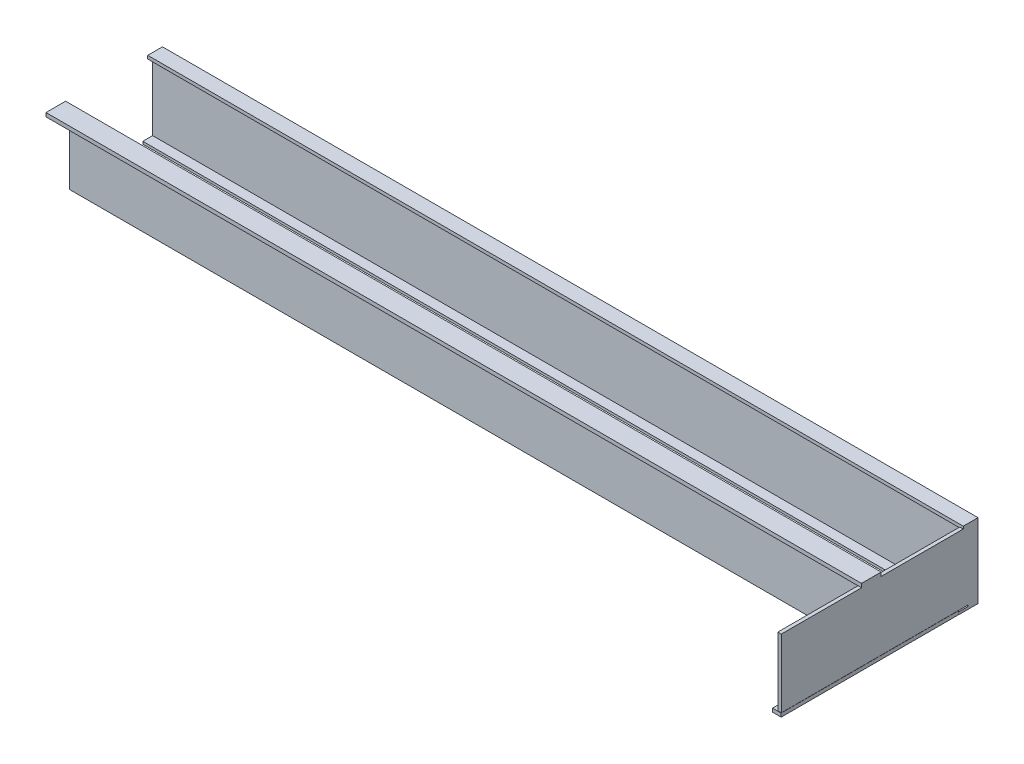
ISO-10303-21;
HEADER;
FILE_DESCRIPTION(('STEP AP214'),'2;1');
FILE_NAME('part.step','',(''),(''),'','','');
FILE_SCHEMA(('AUTOMOTIVE_DESIGN { 1 0 10303 214 1 1 1 1 }'));
ENDSEC;
DATA;
#1=APPLICATION_CONTEXT('core data for automotive mechanical design processes');
#2=APPLICATION_PROTOCOL_DEFINITION('international standard','automotive_design',2000,#1);
#3=PRODUCT_CONTEXT('',#1,'mechanical');
#4=PRODUCT('Part','Part','',(#3));
#5=PRODUCT_RELATED_PRODUCT_CATEGORY('part','',(#4));
#6=PRODUCT_DEFINITION_FORMATION('','',#4);
#7=PRODUCT_DEFINITION_CONTEXT('part definition',#1,'design');
#8=PRODUCT_DEFINITION('design','',#6,#7);
#9=PRODUCT_DEFINITION_SHAPE('','',#8);
#10=(LENGTH_UNIT() NAMED_UNIT(*) SI_UNIT(.MILLI.,.METRE.));
#11=(NAMED_UNIT(*) PLANE_ANGLE_UNIT() SI_UNIT($,.RADIAN.));
#12=(NAMED_UNIT(*) SI_UNIT($,.STERADIAN.) SOLID_ANGLE_UNIT());
#13=UNCERTAINTY_MEASURE_WITH_UNIT(LENGTH_MEASURE(1.E-05),#10,'distance_accuracy_value','');
#14=(GEOMETRIC_REPRESENTATION_CONTEXT(3) GLOBAL_UNCERTAINTY_ASSIGNED_CONTEXT((#13)) GLOBAL_UNIT_ASSIGNED_CONTEXT((#10,
#11,#12)) REPRESENTATION_CONTEXT('',''));
#15=CARTESIAN_POINT('',(0.,0.,0.));
#16=DIRECTION('',(0.,0.,1.));
#17=DIRECTION('',(1.,0.,0.));
#18=AXIS2_PLACEMENT_3D('',#15,#16,#17);
#19=CARTESIAN_POINT('',(752.65421688897,48.3167027315402,200.2));
#20=DIRECTION('',(0.,1.,0.));
#21=DIRECTION('',(0.,0.,1.));
#22=AXIS2_PLACEMENT_3D('',#19,#20,#21);
#23=PLANE('',#22);
#24=DIRECTION('',(0.,0.,-1.));
#25=VECTOR('',#24,1.);
#26=CARTESIAN_POINT('',(-70.8857831110296,48.3167027315402,98.0715094892939));
#27=LINE('',#26,#25);
#28=CARTESIAN_POINT('',(-70.8857831110296,48.3167027315402,98.5390276445217));
#29=VERTEX_POINT('',#28);
#30=CARTESIAN_POINT('',(-70.8857831110296,48.3167027315402,98.0715094892939));
#31=VERTEX_POINT('',#30);
#32=EDGE_CURVE('E266',#29,#31,#27,.T.);
#33=ORIENTED_EDGE('',*,*,#32,.F.);
#34=DIRECTION('',(-1.,0.,0.));
#35=VECTOR('',#34,1.);
#36=CARTESIAN_POINT('',(752.65421688897,48.3167027315402,98.5390276445217));
#37=LINE('',#36,#35);
#38=CARTESIAN_POINT('',(752.65421688897,48.3167027315402,98.5390276445217));
#39=VERTEX_POINT('',#38);
#40=EDGE_CURVE('E50',#39,#29,#37,.T.);
#41=ORIENTED_EDGE('',*,*,#40,.F.);
#42=DIRECTION('',(0.,0.,-1.));
#43=VECTOR('',#42,1.);
#44=CARTESIAN_POINT('',(752.65421688897,48.3167027315402,200.2));
#45=LINE('',#44,#43);
#46=CARTESIAN_POINT('',(752.65421688897,48.3167027315402,15.));
#47=VERTEX_POINT('',#46);
#48=EDGE_CURVE('E249',#39,#47,#45,.T.);
#49=ORIENTED_EDGE('',*,*,#48,.T.);
#50=DIRECTION('',(1.,0.,0.));
#51=VECTOR('',#50,1.);
#52=CARTESIAN_POINT('',(-77.3457831110296,48.3167027315402,15.));
#53=LINE('',#52,#51);
#54=CARTESIAN_POINT('',(749.11421688897,48.3167027315402,15.));
#55=VERTEX_POINT('',#54);
#56=EDGE_CURVE('E425',#55,#47,#53,.T.);
#57=ORIENTED_EDGE('',*,*,#56,.F.);
#58=DIRECTION('',(0.,0.,-1.));
#59=VECTOR('',#58,1.);
#60=CARTESIAN_POINT('',(749.11421688897,48.3167027315402,200.2));
#61=LINE('',#60,#59);
#62=CARTESIAN_POINT('',(749.11421688897,48.3167027315402,98.0715094892939));
#63=VERTEX_POINT('',#62);
#64=EDGE_CURVE('E359',#63,#55,#61,.T.);
#65=ORIENTED_EDGE('',*,*,#64,.F.);
#66=DIRECTION('',(1.,0.,0.));
#67=VECTOR('',#66,1.);
#68=CARTESIAN_POINT('',(-70.8857831110296,48.3167027315402,98.0715094892939));
#69=LINE('',#68,#67);
#70=EDGE_CURVE('E270',#31,#63,#69,.T.);
#71=ORIENTED_EDGE('',*,*,#70,.F.);
#72=EDGE_LOOP('',(#33,#41,#49,#57,#65,#71));
#73=FACE_BOUND('',#72,.T.);
#74=ADVANCED_FACE('F35',(#73),#23,.T.);
#75=CARTESIAN_POINT('',(752.65421688897,48.3167027315402,200.2));
#76=VERTEX_POINT('',#75);
#77=CARTESIAN_POINT('',(752.65421688897,48.3167027315402,118.539027644522));
#78=VERTEX_POINT('',#77);
#79=EDGE_CURVE('E352',#76,#78,#45,.T.);
#80=ORIENTED_EDGE('',*,*,#79,.T.);
#81=DIRECTION('',(1.,0.,0.));
#82=VECTOR('',#81,1.);
#83=CARTESIAN_POINT('',(752.65421688897,48.3167027315402,118.539027644522));
#84=LINE('',#83,#82);
#85=CARTESIAN_POINT('',(749.11421688897,48.3167027315402,118.539027644522));
#86=VERTEX_POINT('',#85);
#87=EDGE_CURVE('E524',#86,#78,#84,.T.);
#88=ORIENTED_EDGE('',*,*,#87,.F.);
#89=CARTESIAN_POINT('',(749.11421688897,48.3167027315402,200.2));
#90=VERTEX_POINT('',#89);
#91=EDGE_CURVE('E356',#90,#86,#61,.T.);
#92=ORIENTED_EDGE('',*,*,#91,.F.);
#93=DIRECTION('',(1.,0.,0.));
#94=VECTOR('',#93,1.);
#95=CARTESIAN_POINT('',(752.65421688897,48.3167027315402,200.2));
#96=LINE('',#95,#94);
#97=EDGE_CURVE('E348',#90,#76,#96,.T.);
#98=ORIENTED_EDGE('',*,*,#97,.T.);
#99=EDGE_LOOP('',(#80,#88,#92,#98));
#100=FACE_BOUND('',#99,.T.);
#101=ADVANCED_FACE('F547',(#100),#23,.T.);
#102=CARTESIAN_POINT('',(749.11421688897,48.3167027315402,200.2));
#103=DIRECTION('',(-1.,0.,0.));
#104=DIRECTION('',(0.,0.,1.));
#105=AXIS2_PLACEMENT_3D('',#102,#103,#104);
#106=PLANE('',#105);
#107=DIRECTION('',(0.,0.,-1.));
#108=VECTOR('',#107,1.);
#109=CARTESIAN_POINT('',(749.11421688897,-21.0832972684598,200.2));
#110=LINE('',#109,#108);
#111=CARTESIAN_POINT('',(749.11421688897,-21.0832972684598,98.0715094892939));
#112=VERTEX_POINT('',#111);
#113=CARTESIAN_POINT('',(749.11421688897,-21.0832972684598,19.7778041345131));
#114=VERTEX_POINT('',#113);
#115=EDGE_CURVE('E362',#112,#114,#110,.T.);
#116=ORIENTED_EDGE('',*,*,#115,.F.);
#117=DIRECTION('',(0.,-1.,0.));
#118=VECTOR('',#117,1.);
#119=CARTESIAN_POINT('',(749.11421688897,48.3167027315402,98.0715094892939));
#120=LINE('',#119,#118);
#121=EDGE_CURVE('E58',#63,#112,#120,.T.);
#122=ORIENTED_EDGE('',*,*,#121,.F.);
#123=ORIENTED_EDGE('',*,*,#64,.T.);
#124=DIRECTION('',(0.,1.,0.));
#125=VECTOR('',#124,1.);
#126=CARTESIAN_POINT('',(749.11421688897,50.8319277206722,15.));
#127=LINE('',#126,#125);
#128=CARTESIAN_POINT('',(749.11421688897,47.5519277206722,15.));
#129=VERTEX_POINT('',#128);
#130=EDGE_CURVE('E355',#129,#55,#127,.T.);
#131=ORIENTED_EDGE('',*,*,#130,.F.);
#132=DIRECTION('',(0.,0.,1.));
#133=VECTOR('',#132,1.);
#134=CARTESIAN_POINT('',(749.11421688897,47.5519277206722,0.));
#135=LINE('',#134,#133);
#136=CARTESIAN_POINT('',(749.11421688897,47.5519277206722,10.));
#137=VERTEX_POINT('',#136);
#138=EDGE_CURVE('E419',#137,#129,#135,.T.);
#139=ORIENTED_EDGE('',*,*,#138,.F.);
#140=DIRECTION('',(0.,1.,0.));
#141=VECTOR('',#140,1.);
#142=CARTESIAN_POINT('',(749.11421688897,-22.4480722793276,10.));
#143=LINE('',#142,#141);
#144=CARTESIAN_POINT('',(749.11421688897,-21.0832972684598,10.));
#145=VERTEX_POINT('',#144);
#146=EDGE_CURVE('E369',#145,#137,#143,.T.);
#147=ORIENTED_EDGE('',*,*,#146,.F.);
#148=EDGE_CURVE('E363',#114,#145,#110,.T.);
#149=ORIENTED_EDGE('',*,*,#148,.F.);
#150=EDGE_LOOP('',(#116,#122,#123,#131,#139,#147,#149));
#151=FACE_BOUND('',#150,.T.);
#152=ADVANCED_FACE('F471',(#151),#106,.T.);
#153=ORIENTED_EDGE('',*,*,#91,.T.);
#154=DIRECTION('',(0.,0.,1.));
#155=VECTOR('',#154,1.);
#156=CARTESIAN_POINT('',(749.11421688897,48.3167027315402,200.2));
#157=LINE('',#156,#155);
#158=CARTESIAN_POINT('',(749.11421688897,48.3167027315402,101.161509489294));
#159=VERTEX_POINT('',#158);
#160=EDGE_CURVE('E250',#159,#86,#157,.T.);
#161=ORIENTED_EDGE('',*,*,#160,.F.);
#162=DIRECTION('',(0.,1.,0.));
#163=VECTOR('',#162,1.);
#164=CARTESIAN_POINT('',(749.11421688897,48.3167027315402,101.161509489294));
#165=LINE('',#164,#163);
#166=CARTESIAN_POINT('',(749.11421688897,-21.0832972684598,101.161509489294));
#167=VERTEX_POINT('',#166);
#168=EDGE_CURVE('E261',#167,#159,#165,.T.);
#169=ORIENTED_EDGE('',*,*,#168,.F.);
#170=CARTESIAN_POINT('',(749.11421688897,-21.0832972684598,200.2));
#171=VERTEX_POINT('',#170);
#172=EDGE_CURVE('E360',#171,#167,#110,.T.);
#173=ORIENTED_EDGE('',*,*,#172,.F.);
#174=DIRECTION('',(0.,1.,0.));
#175=VECTOR('',#174,1.);
#176=CARTESIAN_POINT('',(749.11421688897,48.3167027315402,200.2));
#177=LINE('',#176,#175);
#178=EDGE_CURVE('E345',#171,#90,#177,.T.);
#179=ORIENTED_EDGE('',*,*,#178,.T.);
#180=EDGE_LOOP('',(#153,#161,#169,#173,#179));
#181=FACE_BOUND('',#180,.T.);
#182=ADVANCED_FACE('F544',(#181),#106,.T.);
#183=CARTESIAN_POINT('',(0.,-21.0832972684598,0.));
#184=DIRECTION('',(0.,-1.,0.));
#185=DIRECTION('',(0.,0.,-1.));
#186=AXIS2_PLACEMENT_3D('',#183,#184,#185);
#187=PLANE('',#186);
#188=DIRECTION('',(-1.,0.,0.));
#189=VECTOR('',#188,1.);
#190=CARTESIAN_POINT('',(0.,-21.0832972684598,98.0715094892939));
#191=LINE('',#190,#189);
#192=CARTESIAN_POINT('',(744.090154606766,-21.0832972684598,98.0715094892939));
#193=VERTEX_POINT('',#192);
#194=EDGE_CURVE('E11',#112,#193,#191,.T.);
#195=ORIENTED_EDGE('',*,*,#194,.F.);
#196=ORIENTED_EDGE('',*,*,#115,.T.);
#197=DIRECTION('',(1.,0.,0.));
#198=VECTOR('',#197,1.);
#199=CARTESIAN_POINT('',(752.821045325732,-21.0832972684598,19.7778041345131));
#200=LINE('',#199,#198);
#201=CARTESIAN_POINT('',(744.090154606766,-21.0832972684598,19.7778041345131));
#202=VERTEX_POINT('',#201);
#203=EDGE_CURVE('E289',#202,#114,#200,.T.);
#204=ORIENTED_EDGE('',*,*,#203,.F.);
#205=DIRECTION('',(0.,0.,-1.));
#206=VECTOR('',#205,1.);
#207=CARTESIAN_POINT('',(744.090154606766,-21.0832972684598,19.7778041345131));
#208=LINE('',#207,#206);
#209=EDGE_CURVE('E301',#193,#202,#208,.T.);
#210=ORIENTED_EDGE('',*,*,#209,.F.);
#211=EDGE_LOOP('',(#195,#196,#204,#210));
#212=FACE_BOUND('',#211,.T.);
#213=ADVANCED_FACE('F464',(#212),#187,.F.);
#214=DIRECTION('',(1.,0.,0.));
#215=VECTOR('',#214,1.);
#216=CARTESIAN_POINT('',(0.,-21.0832972684598,101.161509489294));
#217=LINE('',#216,#215);
#218=CARTESIAN_POINT('',(744.090154606766,-21.0832972684598,101.161509489294));
#219=VERTEX_POINT('',#218);
#220=EDGE_CURVE('E43',#219,#167,#217,.T.);
#221=ORIENTED_EDGE('',*,*,#220,.F.);
#222=CARTESIAN_POINT('',(744.090154606766,-21.0832972684598,200.529978071323));
#223=VERTEX_POINT('',#222);
#224=EDGE_CURVE('E302',#223,#219,#208,.T.);
#225=ORIENTED_EDGE('',*,*,#224,.F.);
#226=DIRECTION('',(-1.,0.,0.));
#227=VECTOR('',#226,1.);
#228=CARTESIAN_POINT('',(752.821045325732,-21.0832972684598,200.529978071323));
#229=LINE('',#228,#227);
#230=CARTESIAN_POINT('',(752.821045325732,-21.0832972684598,200.529978071323));
#231=VERTEX_POINT('',#230);
#232=EDGE_CURVE('E299',#231,#223,#229,.T.);
#233=ORIENTED_EDGE('',*,*,#232,.F.);
#234=DIRECTION('',(0.,0.,1.));
#235=VECTOR('',#234,1.);
#236=CARTESIAN_POINT('',(752.821045325732,-21.0832972684598,19.7778041345131));
#237=LINE('',#236,#235);
#238=CARTESIAN_POINT('',(752.821045325732,-21.0832972684598,19.7778041345131));
#239=VERTEX_POINT('',#238);
#240=EDGE_CURVE('E284',#239,#231,#237,.T.);
#241=ORIENTED_EDGE('',*,*,#240,.F.);
#242=CARTESIAN_POINT('',(752.65421688897,-21.0832972684598,19.7778041345131));
#243=VERTEX_POINT('',#242);
#244=EDGE_CURVE('E305',#243,#239,#200,.T.);
#245=ORIENTED_EDGE('',*,*,#244,.F.);
#246=DIRECTION('',(0.,0.,-1.));
#247=VECTOR('',#246,1.);
#248=CARTESIAN_POINT('',(752.65421688897,-21.0832972684598,200.2));
#249=LINE('',#248,#247);
#250=CARTESIAN_POINT('',(752.65421688897,-21.0832972684598,200.2));
#251=VERTEX_POINT('',#250);
#252=EDGE_CURVE('E364',#251,#243,#249,.T.);
#253=ORIENTED_EDGE('',*,*,#252,.F.);
#254=DIRECTION('',(-1.,0.,0.));
#255=VECTOR('',#254,1.);
#256=CARTESIAN_POINT('',(752.65421688897,-21.0832972684598,200.2));
#257=LINE('',#256,#255);
#258=EDGE_CURVE('E342',#251,#171,#257,.T.);
#259=ORIENTED_EDGE('',*,*,#258,.T.);
#260=ORIENTED_EDGE('',*,*,#172,.T.);
#261=EDGE_LOOP('',(#221,#225,#233,#241,#245,#253,#259,#260));
#262=FACE_BOUND('',#261,.T.);
#263=ADVANCED_FACE('F446',(#262),#187,.F.);
#264=CARTESIAN_POINT('',(752.65421688897,-35.3580722793278,20.));
#265=DIRECTION('',(-1.,0.,0.));
#266=DIRECTION('',(0.,0.,1.));
#267=AXIS2_PLACEMENT_3D('',#264,#265,#266);
#268=PLANE('',#267);
#269=DIRECTION('',(0.,1.,0.));
#270=VECTOR('',#269,1.);
#271=CARTESIAN_POINT('',(752.65421688897,-35.3580722793278,19.7778041345131));
#272=LINE('',#271,#270);
#273=CARTESIAN_POINT('',(752.65421688897,-24.7032972684598,19.7778041345131));
#274=VERTEX_POINT('',#273);
#275=CARTESIAN_POINT('',(752.65421688897,-22.4480722793276,19.7778041345131));
#276=VERTEX_POINT('',#275);
#277=EDGE_CURVE('E324',#274,#276,#272,.T.);
#278=ORIENTED_EDGE('',*,*,#277,.F.);
#279=DIRECTION('',(0.,0.,1.));
#280=VECTOR('',#279,1.);
#281=CARTESIAN_POINT('',(752.65421688897,-24.7032972684598,20.));
#282=LINE('',#281,#280);
#283=CARTESIAN_POINT('',(752.65421688897,-24.7032972684598,20.));
#284=VERTEX_POINT('',#283);
#285=EDGE_CURVE('E330',#274,#284,#282,.T.);
#286=ORIENTED_EDGE('',*,*,#285,.T.);
#287=DIRECTION('',(0.,1.,0.));
#288=VECTOR('',#287,1.);
#289=CARTESIAN_POINT('',(752.65421688897,-35.3580722793278,20.));
#290=LINE('',#289,#288);
#291=CARTESIAN_POINT('',(752.65421688897,-24.958341139177,20.));
#292=VERTEX_POINT('',#291);
#293=EDGE_CURVE('E415',#292,#284,#290,.T.);
#294=ORIENTED_EDGE('',*,*,#293,.F.);
#295=DIRECTION('',(0.,0.,-1.));
#296=VECTOR('',#295,1.);
#297=CARTESIAN_POINT('',(752.65421688897,-24.958341139177,20.));
#298=LINE('',#297,#296);
#299=CARTESIAN_POINT('',(752.65421688897,-24.958341139177,0.));
#300=VERTEX_POINT('',#299);
#301=EDGE_CURVE('E336',#292,#300,#298,.T.);
#302=ORIENTED_EDGE('',*,*,#301,.T.);
#303=DIRECTION('',(0.,1.,0.));
#304=VECTOR('',#303,1.);
#305=CARTESIAN_POINT('',(752.65421688897,-35.3580722793278,0.));
#306=LINE('',#305,#304);
#307=CARTESIAN_POINT('',(752.65421688897,50.8319277206722,0.));
#308=VERTEX_POINT('',#307);
#309=EDGE_CURVE('E416',#300,#308,#306,.T.);
#310=ORIENTED_EDGE('',*,*,#309,.T.);
#311=DIRECTION('',(0.,0.,-1.));
#312=VECTOR('',#311,1.);
#313=CARTESIAN_POINT('',(752.65421688897,50.8319277206722,0.));
#314=LINE('',#313,#312);
#315=CARTESIAN_POINT('',(752.65421688897,50.8319277206722,15.));
#316=VERTEX_POINT('',#315);
#317=EDGE_CURVE('E379',#316,#308,#314,.T.);
#318=ORIENTED_EDGE('',*,*,#317,.F.);
#319=DIRECTION('',(0.,-1.,0.));
#320=VECTOR('',#319,1.);
#321=CARTESIAN_POINT('',(752.65421688897,50.8319277206722,15.));
#322=LINE('',#321,#320);
#323=EDGE_CURVE('E385',#316,#47,#322,.T.);
#324=ORIENTED_EDGE('',*,*,#323,.T.);
#325=ORIENTED_EDGE('',*,*,#48,.F.);
#326=DIRECTION('',(0.,-1.,0.));
#327=VECTOR('',#326,1.);
#328=CARTESIAN_POINT('',(752.65421688897,52.1667027315402,98.5390276445217));
#329=LINE('',#328,#327);
#330=CARTESIAN_POINT('',(752.65421688897,52.1667027315402,98.5390276445217));
#331=VERTEX_POINT('',#330);
#332=EDGE_CURVE('E229',#331,#39,#329,.T.);
#333=ORIENTED_EDGE('',*,*,#332,.F.);
#334=DIRECTION('',(0.,0.,-1.));
#335=VECTOR('',#334,1.);
#336=CARTESIAN_POINT('',(752.65421688897,52.1667027315402,98.5390276445217));
#337=LINE('',#336,#335);
#338=CARTESIAN_POINT('',(752.65421688897,52.1667027315402,118.539027644522));
#339=VERTEX_POINT('',#338);
#340=EDGE_CURVE('E235',#339,#331,#337,.T.);
#341=ORIENTED_EDGE('',*,*,#340,.F.);
#342=DIRECTION('',(0.,-1.,0.));
#343=VECTOR('',#342,1.);
#344=CARTESIAN_POINT('',(752.65421688897,52.1667027315402,118.539027644522));
#345=LINE('',#344,#343);
#346=EDGE_CURVE('E531',#339,#78,#345,.T.);
#347=ORIENTED_EDGE('',*,*,#346,.T.);
#348=ORIENTED_EDGE('',*,*,#79,.F.);
#349=DIRECTION('',(0.,-1.,0.));
#350=VECTOR('',#349,1.);
#351=CARTESIAN_POINT('',(752.65421688897,48.3167027315402,200.2));
#352=LINE('',#351,#350);
#353=EDGE_CURVE('E339',#76,#251,#352,.T.);
#354=ORIENTED_EDGE('',*,*,#353,.T.);
#355=ORIENTED_EDGE('',*,*,#252,.T.);
#356=CARTESIAN_POINT('',(752.65421688897,-21.0832972684598,10.));
#357=VERTEX_POINT('',#356);
#358=EDGE_CURVE('E351',#243,#357,#249,.T.);
#359=ORIENTED_EDGE('',*,*,#358,.T.);
#360=DIRECTION('',(0.,1.,0.));
#361=VECTOR('',#360,1.);
#362=CARTESIAN_POINT('',(752.65421688897,-22.4480722793276,10.));
#363=LINE('',#362,#361);
#364=CARTESIAN_POINT('',(752.65421688897,-22.4480722793276,10.));
#365=VERTEX_POINT('',#364);
#366=EDGE_CURVE('E404',#365,#357,#363,.T.);
#367=ORIENTED_EDGE('',*,*,#366,.F.);
#368=DIRECTION('',(0.,0.,-1.));
#369=VECTOR('',#368,1.);
#370=CARTESIAN_POINT('',(752.65421688897,-22.4480722793276,20.));
#371=LINE('',#370,#369);
#372=EDGE_CURVE('E399',#276,#365,#371,.T.);
#373=ORIENTED_EDGE('',*,*,#372,.F.);
#374=EDGE_LOOP('',(#278,#286,#294,#302,#310,#318,#324,#325,#333,#341,#347,#348,#354,#355,#359,
#367,#373));
#375=FACE_BOUND('',#374,.T.);
#376=ADVANCED_FACE('F247',(#375),#268,.F.);
#377=CARTESIAN_POINT('',(0.,0.,20.));
#378=DIRECTION('',(0.,0.,-1.));
#379=DIRECTION('',(-1.,0.,0.));
#380=AXIS2_PLACEMENT_3D('',#377,#378,#379);
#381=PLANE('',#380);
#382=DIRECTION('',(0.,-1.,0.));
#383=VECTOR('',#382,1.);
#384=CARTESIAN_POINT('',(744.090154606766,0.,20.));
#385=LINE('',#384,#383);
#386=CARTESIAN_POINT('',(744.090154606766,-22.4480722793276,20.));
#387=VERTEX_POINT('',#386);
#388=CARTESIAN_POINT('',(744.090154606766,-24.7032972684598,20.));
#389=VERTEX_POINT('',#388);
#390=EDGE_CURVE('E327',#387,#389,#385,.T.);
#391=ORIENTED_EDGE('',*,*,#390,.F.);
#392=DIRECTION('',(1.,0.,0.));
#393=VECTOR('',#392,1.);
#394=CARTESIAN_POINT('',(-77.3457831110296,-22.4480722793276,20.));
#395=LINE('',#394,#393);
#396=CARTESIAN_POINT('',(-77.3457831110296,-22.4480722793276,20.));
#397=VERTEX_POINT('',#396);
#398=EDGE_CURVE('E396',#397,#387,#395,.T.);
#399=ORIENTED_EDGE('',*,*,#398,.F.);
#400=DIRECTION('',(0.,-1.,0.));
#401=VECTOR('',#400,1.);
#402=CARTESIAN_POINT('',(-77.3457831110296,-35.3580722793278,20.));
#403=LINE('',#402,#401);
#404=CARTESIAN_POINT('',(-77.3457831110296,-24.958341139177,20.));
#405=VERTEX_POINT('',#404);
#406=EDGE_CURVE('E412',#397,#405,#403,.T.);
#407=ORIENTED_EDGE('',*,*,#406,.T.);
#408=DIRECTION('',(-1.,0.,0.));
#409=VECTOR('',#408,1.);
#410=CARTESIAN_POINT('',(922.85421688897,-24.958341139177,20.));
#411=LINE('',#410,#409);
#412=EDGE_CURVE('E334',#292,#405,#411,.T.);
#413=ORIENTED_EDGE('',*,*,#412,.F.);
#414=ORIENTED_EDGE('',*,*,#293,.T.);
#415=DIRECTION('',(-1.,0.,0.));
#416=VECTOR('',#415,1.);
#417=CARTESIAN_POINT('',(0.,-24.7032972684598,20.));
#418=LINE('',#417,#416);
#419=EDGE_CURVE('E436',#284,#389,#418,.T.);
#420=ORIENTED_EDGE('',*,*,#419,.T.);
#421=EDGE_LOOP('',(#391,#399,#407,#413,#414,#420));
#422=FACE_BOUND('',#421,.T.);
#423=ADVANCED_FACE('F494',(#422),#381,.F.);
#424=CARTESIAN_POINT('',(0.,-22.4480722793276,0.));
#425=DIRECTION('',(0.,-1.,0.));
#426=DIRECTION('',(0.,0.,-1.));
#427=AXIS2_PLACEMENT_3D('',#424,#425,#426);
#428=PLANE('',#427);
#429=DIRECTION('',(0.,0.,1.));
#430=VECTOR('',#429,1.);
#431=CARTESIAN_POINT('',(744.090154606766,-22.4480722793276,0.));
#432=LINE('',#431,#430);
#433=CARTESIAN_POINT('',(744.090154606766,-22.4480722793276,19.7778041345131));
#434=VERTEX_POINT('',#433);
#435=EDGE_CURVE('E433',#434,#387,#432,.T.);
#436=ORIENTED_EDGE('',*,*,#435,.F.);
#437=DIRECTION('',(-1.,0.,0.));
#438=VECTOR('',#437,1.);
#439=CARTESIAN_POINT('',(0.,-22.4480722793276,19.7778041345131));
#440=LINE('',#439,#438);
#441=EDGE_CURVE('E321',#276,#434,#440,.T.);
#442=ORIENTED_EDGE('',*,*,#441,.F.);
#443=ORIENTED_EDGE('',*,*,#372,.T.);
#444=DIRECTION('',(-1.,0.,0.));
#445=VECTOR('',#444,1.);
#446=CARTESIAN_POINT('',(-77.3457831110296,-22.4480722793276,10.));
#447=LINE('',#446,#445);
#448=CARTESIAN_POINT('',(-77.3457831110296,-22.4480722793276,10.));
#449=VERTEX_POINT('',#448);
#450=EDGE_CURVE('E401',#365,#449,#447,.T.);
#451=ORIENTED_EDGE('',*,*,#450,.T.);
#452=DIRECTION('',(0.,0.,1.));
#453=VECTOR('',#452,1.);
#454=CARTESIAN_POINT('',(-77.3457831110296,-22.4480722793276,20.));
#455=LINE('',#454,#453);
#456=EDGE_CURVE('E394',#449,#397,#455,.T.);
#457=ORIENTED_EDGE('',*,*,#456,.T.);
#458=ORIENTED_EDGE('',*,*,#398,.T.);
#459=EDGE_LOOP('',(#436,#442,#443,#451,#457,#458));
#460=FACE_BOUND('',#459,.T.);
#461=ADVANCED_FACE('F498',(#460),#428,.F.);
#462=CARTESIAN_POINT('',(752.65421688897,-21.0832972684598,200.2));
#463=DIRECTION('',(0.,-1.,0.));
#464=DIRECTION('',(0.,0.,-1.));
#465=AXIS2_PLACEMENT_3D('',#462,#463,#464);
#466=PLANE('',#465);
#467=ORIENTED_EDGE('',*,*,#358,.F.);
#468=EDGE_CURVE('E309',#114,#243,#200,.T.);
#469=ORIENTED_EDGE('',*,*,#468,.F.);
#470=ORIENTED_EDGE('',*,*,#148,.T.);
#471=DIRECTION('',(-1.,0.,0.));
#472=VECTOR('',#471,1.);
#473=CARTESIAN_POINT('',(-77.3457831110296,-21.0832972684598,10.));
#474=LINE('',#473,#472);
#475=EDGE_CURVE('E428',#357,#145,#474,.T.);
#476=ORIENTED_EDGE('',*,*,#475,.F.);
#477=EDGE_LOOP('',(#467,#469,#470,#476));
#478=FACE_BOUND('',#477,.T.);
#479=ADVANCED_FACE('F468',(#478),#466,.T.);
#480=CARTESIAN_POINT('',(-77.3457831110296,-35.3580722793278,20.));
#481=DIRECTION('',(1.,0.,0.));
#482=DIRECTION('',(0.,0.,-1.));
#483=AXIS2_PLACEMENT_3D('',#480,#481,#482);
#484=PLANE('',#483);
#485=DIRECTION('',(0.,-1.,0.));
#486=VECTOR('',#485,1.);
#487=CARTESIAN_POINT('',(-77.3457831110296,-35.3580722793278,0.));
#488=LINE('',#487,#486);
#489=CARTESIAN_POINT('',(-77.3457831110296,50.8319277206722,0.));
#490=VERTEX_POINT('',#489);
#491=CARTESIAN_POINT('',(-77.3457831110296,-24.958341139177,0.));
#492=VERTEX_POINT('',#491);
#493=EDGE_CURVE('E409',#490,#492,#488,.T.);
#494=ORIENTED_EDGE('',*,*,#493,.T.);
#495=DIRECTION('',(0.,0.,-1.));
#496=VECTOR('',#495,1.);
#497=CARTESIAN_POINT('',(-77.3457831110296,-24.958341139177,0.));
#498=LINE('',#497,#496);
#499=EDGE_CURVE('E332',#405,#492,#498,.T.);
#500=ORIENTED_EDGE('',*,*,#499,.F.);
#501=ORIENTED_EDGE('',*,*,#406,.F.);
#502=ORIENTED_EDGE('',*,*,#456,.F.);
#503=DIRECTION('',(0.,1.,0.));
#504=VECTOR('',#503,1.);
#505=CARTESIAN_POINT('',(-77.3457831110296,-22.4480722793276,10.));
#506=LINE('',#505,#504);
#507=CARTESIAN_POINT('',(-77.3457831110296,47.5519277206722,10.));
#508=VERTEX_POINT('',#507);
#509=EDGE_CURVE('E406',#449,#508,#506,.T.);
#510=ORIENTED_EDGE('',*,*,#509,.T.);
#511=DIRECTION('',(0.,0.,1.));
#512=VECTOR('',#511,1.);
#513=CARTESIAN_POINT('',(-77.3457831110296,47.5519277206722,0.));
#514=LINE('',#513,#512);
#515=CARTESIAN_POINT('',(-77.3457831110296,47.5519277206722,15.));
#516=VERTEX_POINT('',#515);
#517=EDGE_CURVE('E372',#508,#516,#514,.T.);
#518=ORIENTED_EDGE('',*,*,#517,.T.);
#519=DIRECTION('',(0.,-1.,0.));
#520=VECTOR('',#519,1.);
#521=CARTESIAN_POINT('',(-77.3457831110296,50.8319277206722,15.));
#522=LINE('',#521,#520);
#523=CARTESIAN_POINT('',(-77.3457831110296,50.8319277206722,15.));
#524=VERTEX_POINT('',#523);
#525=EDGE_CURVE('E390',#524,#516,#522,.T.);
#526=ORIENTED_EDGE('',*,*,#525,.F.);
#527=DIRECTION('',(0.,0.,1.));
#528=VECTOR('',#527,1.);
#529=CARTESIAN_POINT('',(-77.3457831110296,50.8319277206722,0.));
#530=LINE('',#529,#528);
#531=EDGE_CURVE('E373',#490,#524,#530,.T.);
#532=ORIENTED_EDGE('',*,*,#531,.F.);
#533=EDGE_LOOP('',(#494,#500,#501,#502,#510,#518,#526,#532));
#534=FACE_BOUND('',#533,.T.);
#535=ADVANCED_FACE('F37',(#534),#484,.F.);
#536=CARTESIAN_POINT('',(0.,0.,0.));
#537=DIRECTION('',(0.,0.,-1.));
#538=DIRECTION('',(-1.,0.,0.));
#539=AXIS2_PLACEMENT_3D('',#536,#537,#538);
#540=PLANE('',#539);
#541=DIRECTION('',(1.,0.,0.));
#542=VECTOR('',#541,1.);
#543=CARTESIAN_POINT('',(0.,-24.958341139177,0.));
#544=LINE('',#543,#542);
#545=EDGE_CURVE('E431',#492,#300,#544,.T.);
#546=ORIENTED_EDGE('',*,*,#545,.F.);
#547=ORIENTED_EDGE('',*,*,#493,.F.);
#548=DIRECTION('',(-1.,0.,0.));
#549=VECTOR('',#548,1.);
#550=CARTESIAN_POINT('',(-77.3457831110296,50.8319277206722,0.));
#551=LINE('',#550,#549);
#552=EDGE_CURVE('E382',#308,#490,#551,.T.);
#553=ORIENTED_EDGE('',*,*,#552,.F.);
#554=ORIENTED_EDGE('',*,*,#309,.F.);
#555=EDGE_LOOP('',(#546,#547,#553,#554));
#556=FACE_BOUND('',#555,.T.);
#557=ADVANCED_FACE('F508',(#556),#540,.T.);
#558=CARTESIAN_POINT('',(-77.3457831110296,-22.4480722793276,10.));
#559=DIRECTION('',(0.,0.,-1.));
#560=DIRECTION('',(-1.,0.,0.));
#561=AXIS2_PLACEMENT_3D('',#558,#559,#560);
#562=PLANE('',#561);
#563=ORIENTED_EDGE('',*,*,#475,.T.);
#564=ORIENTED_EDGE('',*,*,#146,.T.);
#565=DIRECTION('',(-1.,0.,0.));
#566=VECTOR('',#565,1.);
#567=CARTESIAN_POINT('',(-77.3457831110296,47.5519277206722,10.));
#568=LINE('',#567,#566);
#569=EDGE_CURVE('E393',#137,#508,#568,.T.);
#570=ORIENTED_EDGE('',*,*,#569,.T.);
#571=ORIENTED_EDGE('',*,*,#509,.F.);
#572=ORIENTED_EDGE('',*,*,#450,.F.);
#573=ORIENTED_EDGE('',*,*,#366,.T.);
#574=EDGE_LOOP('',(#563,#564,#570,#571,#572,#573));
#575=FACE_BOUND('',#574,.T.);
#576=ADVANCED_FACE('F474',(#575),#562,.F.);
#577=CARTESIAN_POINT('',(-77.3457831110296,50.8319277206722,15.));
#578=DIRECTION('',(0.,0.,-1.));
#579=DIRECTION('',(-1.,0.,0.));
#580=AXIS2_PLACEMENT_3D('',#577,#578,#579);
#581=PLANE('',#580);
#582=ORIENTED_EDGE('',*,*,#130,.T.);
#583=ORIENTED_EDGE('',*,*,#56,.T.);
#584=ORIENTED_EDGE('',*,*,#323,.F.);
#585=DIRECTION('',(1.,0.,0.));
#586=VECTOR('',#585,1.);
#587=CARTESIAN_POINT('',(-77.3457831110296,50.8319277206722,15.));
#588=LINE('',#587,#586);
#589=EDGE_CURVE('E376',#524,#316,#588,.T.);
#590=ORIENTED_EDGE('',*,*,#589,.F.);
#591=ORIENTED_EDGE('',*,*,#525,.T.);
#592=DIRECTION('',(1.,0.,0.));
#593=VECTOR('',#592,1.);
#594=CARTESIAN_POINT('',(-77.3457831110296,47.5519277206722,15.));
#595=LINE('',#594,#593);
#596=EDGE_CURVE('E377',#516,#129,#595,.T.);
#597=ORIENTED_EDGE('',*,*,#596,.T.);
#598=EDGE_LOOP('',(#582,#583,#584,#590,#591,#597));
#599=FACE_BOUND('',#598,.T.);
#600=ADVANCED_FACE('F516',(#599),#581,.F.);
#601=CARTESIAN_POINT('',(0.,50.8319277206722,0.));
#602=DIRECTION('',(0.,1.,0.));
#603=DIRECTION('',(0.,0.,1.));
#604=AXIS2_PLACEMENT_3D('',#601,#602,#603);
#605=PLANE('',#604);
#606=ORIENTED_EDGE('',*,*,#531,.T.);
#607=ORIENTED_EDGE('',*,*,#589,.T.);
#608=ORIENTED_EDGE('',*,*,#317,.T.);
#609=ORIENTED_EDGE('',*,*,#552,.T.);
#610=EDGE_LOOP('',(#606,#607,#608,#609));
#611=FACE_BOUND('',#610,.T.);
#612=ADVANCED_FACE('F512',(#611),#605,.T.);
#613=CARTESIAN_POINT('',(0.,47.5519277206722,0.));
#614=DIRECTION('',(0.,1.,0.));
#615=DIRECTION('',(0.,0.,1.));
#616=AXIS2_PLACEMENT_3D('',#613,#614,#615);
#617=PLANE('',#616);
#618=ORIENTED_EDGE('',*,*,#569,.F.);
#619=ORIENTED_EDGE('',*,*,#138,.T.);
#620=ORIENTED_EDGE('',*,*,#596,.F.);
#621=ORIENTED_EDGE('',*,*,#517,.F.);
#622=EDGE_LOOP('',(#618,#619,#620,#621));
#623=FACE_BOUND('',#622,.T.);
#624=ADVANCED_FACE('F551',(#623),#617,.F.);
#625=CARTESIAN_POINT('',(0.,0.,200.2));
#626=DIRECTION('',(0.,0.,-1.));
#627=DIRECTION('',(-1.,0.,0.));
#628=AXIS2_PLACEMENT_3D('',#625,#626,#627);
#629=PLANE('',#628);
#630=ORIENTED_EDGE('',*,*,#353,.F.);
#631=ORIENTED_EDGE('',*,*,#97,.F.);
#632=ORIENTED_EDGE('',*,*,#178,.F.);
#633=ORIENTED_EDGE('',*,*,#258,.F.);
#634=EDGE_LOOP('',(#630,#631,#632,#633));
#635=FACE_BOUND('',#634,.T.);
#636=ADVANCED_FACE('F549',(#635),#629,.F.);
#637=CARTESIAN_POINT('',(922.85421688897,-24.958341139177,0.));
#638=DIRECTION('',(0.,1.,0.));
#639=DIRECTION('',(0.,0.,1.));
#640=AXIS2_PLACEMENT_3D('',#637,#638,#639);
#641=PLANE('',#640);
#642=ORIENTED_EDGE('',*,*,#412,.T.);
#643=ORIENTED_EDGE('',*,*,#499,.T.);
#644=ORIENTED_EDGE('',*,*,#545,.T.);
#645=ORIENTED_EDGE('',*,*,#301,.F.);
#646=EDGE_LOOP('',(#642,#643,#644,#645));
#647=FACE_BOUND('',#646,.T.);
#648=ADVANCED_FACE('F505',(#647),#641,.F.);
#649=CARTESIAN_POINT('',(0.,-24.7032972684598,0.));
#650=DIRECTION('',(0.,-1.,0.));
#651=DIRECTION('',(0.,0.,-1.));
#652=AXIS2_PLACEMENT_3D('',#649,#650,#651);
#653=PLANE('',#652);
#654=ORIENTED_EDGE('',*,*,#285,.F.);
#655=DIRECTION('',(1.,0.,0.));
#656=VECTOR('',#655,1.);
#657=CARTESIAN_POINT('',(752.821045325732,-24.7032972684598,19.7778041345131));
#658=LINE('',#657,#656);
#659=CARTESIAN_POINT('',(752.821045325732,-24.7032972684598,19.7778041345131));
#660=VERTEX_POINT('',#659);
#661=EDGE_CURVE('E294',#274,#660,#658,.T.);
#662=ORIENTED_EDGE('',*,*,#661,.T.);
#663=DIRECTION('',(0.,0.,1.));
#664=VECTOR('',#663,1.);
#665=CARTESIAN_POINT('',(752.821045325732,-24.7032972684598,19.7778041345131));
#666=LINE('',#665,#664);
#667=CARTESIAN_POINT('',(752.821045325732,-24.7032972684598,200.529978071323));
#668=VERTEX_POINT('',#667);
#669=EDGE_CURVE('E285',#660,#668,#666,.T.);
#670=ORIENTED_EDGE('',*,*,#669,.T.);
#671=DIRECTION('',(-1.,0.,0.));
#672=VECTOR('',#671,1.);
#673=CARTESIAN_POINT('',(752.821045325732,-24.7032972684598,200.529978071323));
#674=LINE('',#673,#672);
#675=CARTESIAN_POINT('',(744.090154606766,-24.7032972684598,200.529978071323));
#676=VERTEX_POINT('',#675);
#677=EDGE_CURVE('E288',#668,#676,#674,.T.);
#678=ORIENTED_EDGE('',*,*,#677,.T.);
#679=DIRECTION('',(0.,0.,-1.));
#680=VECTOR('',#679,1.);
#681=CARTESIAN_POINT('',(744.090154606766,-24.7032972684598,19.7778041345131));
#682=LINE('',#681,#680);
#683=EDGE_CURVE('E291',#676,#389,#682,.T.);
#684=ORIENTED_EDGE('',*,*,#683,.T.);
#685=ORIENTED_EDGE('',*,*,#419,.F.);
#686=EDGE_LOOP('',(#654,#662,#670,#678,#684,#685));
#687=FACE_BOUND('',#686,.T.);
#688=ADVANCED_FACE('F489',(#687),#653,.T.);
#689=CARTESIAN_POINT('',(744.090154606766,-24.7032972684598,19.7778041345131));
#690=DIRECTION('',(1.,0.,0.));
#691=DIRECTION('',(0.,0.,-1.));
#692=AXIS2_PLACEMENT_3D('',#689,#690,#691);
#693=PLANE('',#692);
#694=ORIENTED_EDGE('',*,*,#435,.T.);
#695=ORIENTED_EDGE('',*,*,#390,.T.);
#696=ORIENTED_EDGE('',*,*,#683,.F.);
#697=DIRECTION('',(0.,1.,0.));
#698=VECTOR('',#697,1.);
#699=CARTESIAN_POINT('',(744.090154606766,-24.7032972684598,200.529978071323));
#700=LINE('',#699,#698);
#701=EDGE_CURVE('E315',#676,#223,#700,.T.);
#702=ORIENTED_EDGE('',*,*,#701,.T.);
#703=ORIENTED_EDGE('',*,*,#224,.T.);
#704=EDGE_CURVE('E306',#219,#193,#208,.T.);
#705=ORIENTED_EDGE('',*,*,#704,.T.);
#706=ORIENTED_EDGE('',*,*,#209,.T.);
#707=DIRECTION('',(0.,1.,0.));
#708=VECTOR('',#707,1.);
#709=CARTESIAN_POINT('',(744.090154606766,-24.7032972684598,19.7778041345131));
#710=LINE('',#709,#708);
#711=EDGE_CURVE('E312',#434,#202,#710,.T.);
#712=ORIENTED_EDGE('',*,*,#711,.F.);
#713=EDGE_LOOP('',(#694,#695,#696,#702,#703,#705,#706,#712));
#714=FACE_BOUND('',#713,.T.);
#715=ADVANCED_FACE('F451',(#714),#693,.F.);
#716=CARTESIAN_POINT('',(752.821045325732,-24.7032972684598,19.7778041345131));
#717=DIRECTION('',(0.,0.,1.));
#718=DIRECTION('',(1.,0.,0.));
#719=AXIS2_PLACEMENT_3D('',#716,#717,#718);
#720=PLANE('',#719);
#721=ORIENTED_EDGE('',*,*,#661,.F.);
#722=ORIENTED_EDGE('',*,*,#277,.T.);
#723=ORIENTED_EDGE('',*,*,#441,.T.);
#724=ORIENTED_EDGE('',*,*,#711,.T.);
#725=ORIENTED_EDGE('',*,*,#203,.T.);
#726=ORIENTED_EDGE('',*,*,#468,.T.);
#727=ORIENTED_EDGE('',*,*,#244,.T.);
#728=DIRECTION('',(0.,1.,0.));
#729=VECTOR('',#728,1.);
#730=CARTESIAN_POINT('',(752.821045325732,-24.7032972684598,19.7778041345131));
#731=LINE('',#730,#729);
#732=EDGE_CURVE('E296',#660,#239,#731,.T.);
#733=ORIENTED_EDGE('',*,*,#732,.F.);
#734=EDGE_LOOP('',(#721,#722,#723,#724,#725,#726,#727,#733));
#735=FACE_BOUND('',#734,.T.);
#736=ADVANCED_FACE('F462',(#735),#720,.F.);
#737=CARTESIAN_POINT('',(752.821045325732,-24.7032972684598,19.7778041345131));
#738=DIRECTION('',(-1.,0.,0.));
#739=DIRECTION('',(0.,0.,1.));
#740=AXIS2_PLACEMENT_3D('',#737,#738,#739);
#741=PLANE('',#740);
#742=ORIENTED_EDGE('',*,*,#240,.T.);
#743=DIRECTION('',(0.,1.,0.));
#744=VECTOR('',#743,1.);
#745=CARTESIAN_POINT('',(752.821045325732,-24.7032972684598,200.529978071323));
#746=LINE('',#745,#744);
#747=EDGE_CURVE('E318',#668,#231,#746,.T.);
#748=ORIENTED_EDGE('',*,*,#747,.F.);
#749=ORIENTED_EDGE('',*,*,#669,.F.);
#750=ORIENTED_EDGE('',*,*,#732,.T.);
#751=EDGE_LOOP('',(#742,#748,#749,#750));
#752=FACE_BOUND('',#751,.T.);
#753=ADVANCED_FACE('F485',(#752),#741,.F.);
#754=CARTESIAN_POINT('',(752.821045325732,-24.7032972684598,200.529978071323));
#755=DIRECTION('',(0.,0.,-1.));
#756=DIRECTION('',(-1.,0.,0.));
#757=AXIS2_PLACEMENT_3D('',#754,#755,#756);
#758=PLANE('',#757);
#759=ORIENTED_EDGE('',*,*,#232,.T.);
#760=ORIENTED_EDGE('',*,*,#701,.F.);
#761=ORIENTED_EDGE('',*,*,#677,.F.);
#762=ORIENTED_EDGE('',*,*,#747,.T.);
#763=EDGE_LOOP('',(#759,#760,#761,#762));
#764=FACE_BOUND('',#763,.T.);
#765=ADVANCED_FACE('F597',(#764),#758,.F.);
#766=CARTESIAN_POINT('',(-70.8857831110296,-21.0832972684598,98.0715094892939));
#767=DIRECTION('',(0.,1.,0.));
#768=DIRECTION('',(0.,0.,1.));
#769=AXIS2_PLACEMENT_3D('',#766,#767,#768);
#770=PLANE('',#769);
#771=DIRECTION('',(1.,0.,0.));
#772=VECTOR('',#771,1.);
#773=CARTESIAN_POINT('',(-70.8857831110296,-21.0832972684598,98.0715094892939));
#774=LINE('',#773,#772);
#775=CARTESIAN_POINT('',(-70.8857831110296,-21.0832972684598,98.0715094892939));
#776=VERTEX_POINT('',#775);
#777=EDGE_CURVE('E281',#776,#193,#774,.T.);
#778=ORIENTED_EDGE('',*,*,#777,.T.);
#779=ORIENTED_EDGE('',*,*,#704,.F.);
#780=DIRECTION('',(1.,0.,0.));
#781=VECTOR('',#780,1.);
#782=CARTESIAN_POINT('',(-70.8857831110296,-21.0832972684598,101.161509489294));
#783=LINE('',#782,#781);
#784=CARTESIAN_POINT('',(-70.8857831110296,-21.0832972684598,101.161509489294));
#785=VERTEX_POINT('',#784);
#786=EDGE_CURVE('E278',#785,#219,#783,.T.);
#787=ORIENTED_EDGE('',*,*,#786,.F.);
#788=DIRECTION('',(0.,0.,1.));
#789=VECTOR('',#788,1.);
#790=CARTESIAN_POINT('',(-70.8857831110296,-21.0832972684598,98.0715094892939));
#791=LINE('',#790,#789);
#792=EDGE_CURVE('E260',#776,#785,#791,.T.);
#793=ORIENTED_EDGE('',*,*,#792,.F.);
#794=EDGE_LOOP('',(#778,#779,#787,#793));
#795=FACE_BOUND('',#794,.T.);
#796=ADVANCED_FACE('F455',(#795),#770,.F.);
#797=CARTESIAN_POINT('',(-70.8857831110296,48.3167027315402,98.0715094892939));
#798=DIRECTION('',(0.,0.,1.));
#799=DIRECTION('',(1.,0.,0.));
#800=AXIS2_PLACEMENT_3D('',#797,#798,#799);
#801=PLANE('',#800);
#802=ORIENTED_EDGE('',*,*,#121,.T.);
#803=ORIENTED_EDGE('',*,*,#194,.T.);
#804=ORIENTED_EDGE('',*,*,#777,.F.);
#805=DIRECTION('',(0.,-1.,0.));
#806=VECTOR('',#805,1.);
#807=CARTESIAN_POINT('',(-70.8857831110296,48.3167027315402,98.0715094892939));
#808=LINE('',#807,#806);
#809=EDGE_CURVE('E257',#31,#776,#808,.T.);
#810=ORIENTED_EDGE('',*,*,#809,.F.);
#811=ORIENTED_EDGE('',*,*,#70,.T.);
#812=EDGE_LOOP('',(#802,#803,#804,#810,#811));
#813=FACE_BOUND('',#812,.T.);
#814=ADVANCED_FACE('F617',(#813),#801,.F.);
#815=CARTESIAN_POINT('',(-70.8857831110296,48.3167027315402,101.161509489294));
#816=DIRECTION('',(0.,0.,-1.));
#817=DIRECTION('',(-1.,0.,0.));
#818=AXIS2_PLACEMENT_3D('',#815,#816,#817);
#819=PLANE('',#818);
#820=ORIENTED_EDGE('',*,*,#168,.T.);
#821=DIRECTION('',(1.,0.,0.));
#822=VECTOR('',#821,1.);
#823=CARTESIAN_POINT('',(-70.8857831110296,48.3167027315402,101.161509489294));
#824=LINE('',#823,#822);
#825=CARTESIAN_POINT('',(-70.8857831110296,48.3167027315402,101.161509489294));
#826=VERTEX_POINT('',#825);
#827=EDGE_CURVE('E276',#826,#159,#824,.T.);
#828=ORIENTED_EDGE('',*,*,#827,.F.);
#829=DIRECTION('',(0.,1.,0.));
#830=VECTOR('',#829,1.);
#831=CARTESIAN_POINT('',(-70.8857831110296,48.3167027315402,101.161509489294));
#832=LINE('',#831,#830);
#833=EDGE_CURVE('E263',#785,#826,#832,.T.);
#834=ORIENTED_EDGE('',*,*,#833,.F.);
#835=ORIENTED_EDGE('',*,*,#786,.T.);
#836=ORIENTED_EDGE('',*,*,#220,.T.);
#837=EDGE_LOOP('',(#820,#828,#834,#835,#836));
#838=FACE_BOUND('',#837,.T.);
#839=ADVANCED_FACE('F439',(#838),#819,.F.);
#840=CARTESIAN_POINT('',(-70.8857831110296,0.,0.));
#841=DIRECTION('',(-1.,0.,0.));
#842=DIRECTION('',(0.,0.,1.));
#843=AXIS2_PLACEMENT_3D('',#840,#841,#842);
#844=PLANE('',#843);
#845=ORIENTED_EDGE('',*,*,#809,.T.);
#846=ORIENTED_EDGE('',*,*,#792,.T.);
#847=ORIENTED_EDGE('',*,*,#833,.T.);
#848=EDGE_CURVE('E267',#826,#29,#27,.T.);
#849=ORIENTED_EDGE('',*,*,#848,.T.);
#850=ORIENTED_EDGE('',*,*,#32,.T.);
#851=EDGE_LOOP('',(#845,#846,#847,#849,#850));
#852=FACE_BOUND('',#851,.T.);
#853=ADVANCED_FACE('F631',(#852),#844,.T.);
#854=CARTESIAN_POINT('',(752.65421688897,52.1667027315402,98.5390276445217));
#855=DIRECTION('',(0.,0.,1.));
#856=DIRECTION('',(1.,0.,0.));
#857=AXIS2_PLACEMENT_3D('',#854,#855,#856);
#858=PLANE('',#857);
#859=ORIENTED_EDGE('',*,*,#40,.T.);
#860=CARTESIAN_POINT('',(-77.3457831110296,48.3167027315402,98.5390276445217));
#861=VERTEX_POINT('',#860);
#862=EDGE_CURVE('E522',#29,#861,#37,.T.);
#863=ORIENTED_EDGE('',*,*,#862,.T.);
#864=DIRECTION('',(0.,-1.,0.));
#865=VECTOR('',#864,1.);
#866=CARTESIAN_POINT('',(-77.3457831110296,52.1667027315402,98.5390276445217));
#867=LINE('',#866,#865);
#868=CARTESIAN_POINT('',(-77.3457831110296,52.1667027315402,98.5390276445217));
#869=VERTEX_POINT('',#868);
#870=EDGE_CURVE('E231',#869,#861,#867,.T.);
#871=ORIENTED_EDGE('',*,*,#870,.F.);
#872=DIRECTION('',(-1.,0.,0.));
#873=VECTOR('',#872,1.);
#874=CARTESIAN_POINT('',(752.65421688897,52.1667027315402,98.5390276445217));
#875=LINE('',#874,#873);
#876=EDGE_CURVE('E225',#331,#869,#875,.T.);
#877=ORIENTED_EDGE('',*,*,#876,.F.);
#878=ORIENTED_EDGE('',*,*,#332,.T.);
#879=EDGE_LOOP('',(#859,#863,#871,#877,#878));
#880=FACE_BOUND('',#879,.T.);
#881=ADVANCED_FACE('F227',(#880),#858,.F.);
#882=CARTESIAN_POINT('',(-77.3457831110296,52.1667027315402,98.5390276445217));
#883=DIRECTION('',(1.,0.,0.));
#884=DIRECTION('',(0.,0.,-1.));
#885=AXIS2_PLACEMENT_3D('',#882,#883,#884);
#886=PLANE('',#885);
#887=DIRECTION('',(0.,0.,1.));
#888=VECTOR('',#887,1.);
#889=CARTESIAN_POINT('',(-77.3457831110296,48.3167027315402,98.5390276445217));
#890=LINE('',#889,#888);
#891=CARTESIAN_POINT('',(-77.3457831110296,48.3167027315402,118.539027644522));
#892=VERTEX_POINT('',#891);
#893=EDGE_CURVE('E521',#861,#892,#890,.T.);
#894=ORIENTED_EDGE('',*,*,#893,.T.);
#895=DIRECTION('',(0.,-1.,0.));
#896=VECTOR('',#895,1.);
#897=CARTESIAN_POINT('',(-77.3457831110296,52.1667027315402,118.539027644522));
#898=LINE('',#897,#896);
#899=CARTESIAN_POINT('',(-77.3457831110296,52.1667027315402,118.539027644522));
#900=VERTEX_POINT('',#899);
#901=EDGE_CURVE('E253',#900,#892,#898,.T.);
#902=ORIENTED_EDGE('',*,*,#901,.F.);
#903=DIRECTION('',(0.,0.,1.));
#904=VECTOR('',#903,1.);
#905=CARTESIAN_POINT('',(-77.3457831110296,52.1667027315402,98.5390276445217));
#906=LINE('',#905,#904);
#907=EDGE_CURVE('E234',#869,#900,#906,.T.);
#908=ORIENTED_EDGE('',*,*,#907,.F.);
#909=ORIENTED_EDGE('',*,*,#870,.T.);
#910=EDGE_LOOP('',(#894,#902,#908,#909));
#911=FACE_BOUND('',#910,.T.);
#912=ADVANCED_FACE('F645',(#911),#886,.F.);
#913=CARTESIAN_POINT('',(752.65421688897,52.1667027315402,118.539027644522));
#914=DIRECTION('',(0.,0.,-1.));
#915=DIRECTION('',(-1.,0.,0.));
#916=AXIS2_PLACEMENT_3D('',#913,#914,#915);
#917=PLANE('',#916);
#918=EDGE_CURVE('E244',#892,#86,#84,.T.);
#919=ORIENTED_EDGE('',*,*,#918,.T.);
#920=ORIENTED_EDGE('',*,*,#87,.T.);
#921=ORIENTED_EDGE('',*,*,#346,.F.);
#922=DIRECTION('',(1.,0.,0.));
#923=VECTOR('',#922,1.);
#924=CARTESIAN_POINT('',(752.65421688897,52.1667027315402,118.539027644522));
#925=LINE('',#924,#923);
#926=EDGE_CURVE('E240',#900,#339,#925,.T.);
#927=ORIENTED_EDGE('',*,*,#926,.F.);
#928=ORIENTED_EDGE('',*,*,#901,.T.);
#929=EDGE_LOOP('',(#919,#920,#921,#927,#928));
#930=FACE_BOUND('',#929,.T.);
#931=ADVANCED_FACE('F536',(#930),#917,.F.);
#932=CARTESIAN_POINT('',(0.,52.1667027315402,0.));
#933=DIRECTION('',(0.,-1.,0.));
#934=DIRECTION('',(0.,0.,-1.));
#935=AXIS2_PLACEMENT_3D('',#932,#933,#934);
#936=PLANE('',#935);
#937=ORIENTED_EDGE('',*,*,#340,.T.);
#938=ORIENTED_EDGE('',*,*,#876,.T.);
#939=ORIENTED_EDGE('',*,*,#907,.T.);
#940=ORIENTED_EDGE('',*,*,#926,.T.);
#941=EDGE_LOOP('',(#937,#938,#939,#940));
#942=FACE_BOUND('',#941,.T.);
#943=ADVANCED_FACE('F238',(#942),#936,.F.);
#944=CARTESIAN_POINT('',(0.,48.3167027315402,0.));
#945=DIRECTION('',(0.,-1.,0.));
#946=DIRECTION('',(0.,0.,-1.));
#947=AXIS2_PLACEMENT_3D('',#944,#945,#946);
#948=PLANE('',#947);
#949=ORIENTED_EDGE('',*,*,#827,.T.);
#950=ORIENTED_EDGE('',*,*,#160,.T.);
#951=ORIENTED_EDGE('',*,*,#918,.F.);
#952=ORIENTED_EDGE('',*,*,#893,.F.);
#953=ORIENTED_EDGE('',*,*,#862,.F.);
#954=ORIENTED_EDGE('',*,*,#848,.F.);
#955=EDGE_LOOP('',(#949,#950,#951,#952,#953,#954));
#956=FACE_BOUND('',#955,.T.);
#957=ADVANCED_FACE('F541',(#956),#948,.T.);
#958=CLOSED_SHELL('',(#74,#101,#152,#182,#213,#263,#376,#423,#461,#479,#535,#557,#576,#600,#612,
#624,#636,#648,#688,#715,#736,#753,#765,#796,#814,#839,#853,#881,#912,#931,#943,#957));
#959=MANIFOLD_SOLID_BREP('B2',#958);
#960=ADVANCED_BREP_SHAPE_REPRESENTATION('',(#18,#959),#14);
#961=SHAPE_DEFINITION_REPRESENTATION(#9,#960);
ENDSEC;
END-ISO-10303-21;
